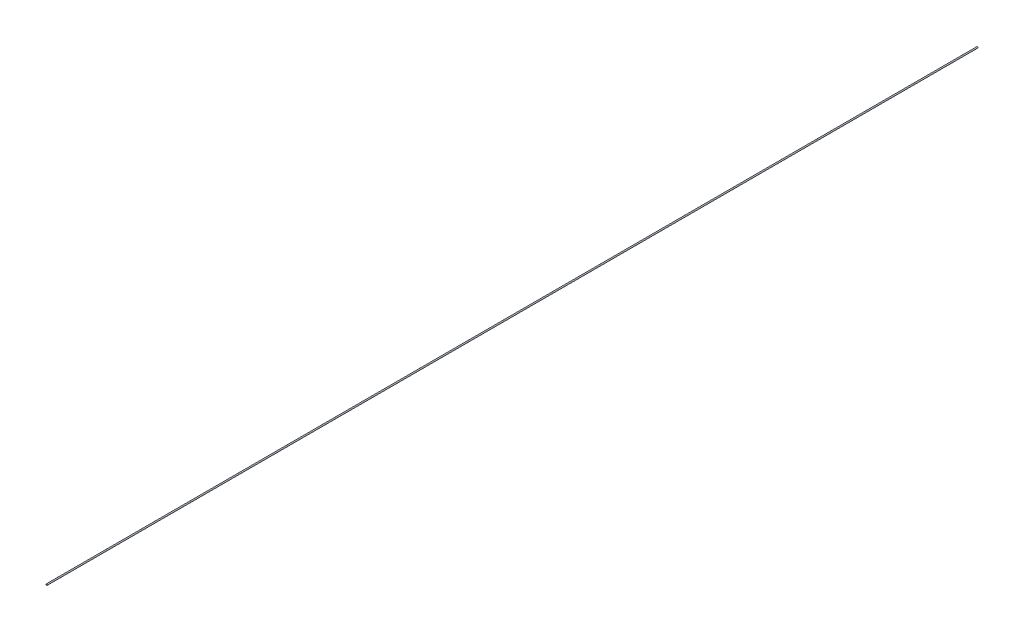
ISO-10303-21;
HEADER;
FILE_DESCRIPTION(('STEP AP214'),'2;1');
FILE_NAME('part.step','',(''),(''),'','','');
FILE_SCHEMA(('AUTOMOTIVE_DESIGN { 1 0 10303 214 1 1 1 1 }'));
ENDSEC;
DATA;
#1=APPLICATION_CONTEXT('core data for automotive mechanical design processes');
#2=APPLICATION_PROTOCOL_DEFINITION('international standard','automotive_design',2000,#1);
#3=PRODUCT_CONTEXT('',#1,'mechanical');
#4=PRODUCT('Part','Part','',(#3));
#5=PRODUCT_RELATED_PRODUCT_CATEGORY('part','',(#4));
#6=PRODUCT_DEFINITION_FORMATION('','',#4);
#7=PRODUCT_DEFINITION_CONTEXT('part definition',#1,'design');
#8=PRODUCT_DEFINITION('design','',#6,#7);
#9=PRODUCT_DEFINITION_SHAPE('','',#8);
#10=(LENGTH_UNIT() NAMED_UNIT(*) SI_UNIT(.MILLI.,.METRE.));
#11=(NAMED_UNIT(*) PLANE_ANGLE_UNIT() SI_UNIT($,.RADIAN.));
#12=(NAMED_UNIT(*) SI_UNIT($,.STERADIAN.) SOLID_ANGLE_UNIT());
#13=UNCERTAINTY_MEASURE_WITH_UNIT(LENGTH_MEASURE(1.E-05),#10,'distance_accuracy_value','');
#14=(GEOMETRIC_REPRESENTATION_CONTEXT(3) GLOBAL_UNCERTAINTY_ASSIGNED_CONTEXT((#13)) GLOBAL_UNIT_ASSIGNED_CONTEXT((#10,
#11,#12)) REPRESENTATION_CONTEXT('',''));
#15=CARTESIAN_POINT('',(0.,0.,0.));
#16=DIRECTION('',(0.,0.,1.));
#17=DIRECTION('',(1.,0.,0.));
#18=AXIS2_PLACEMENT_3D('',#15,#16,#17);
#19=CARTESIAN_POINT('',(0.,0.,-9000.));
#20=DIRECTION('',(0.,0.,1.));
#21=DIRECTION('',(1.,0.,0.));
#22=AXIS2_PLACEMENT_3D('',#19,#20,#21);
#23=CYLINDRICAL_SURFACE('',#22,6.);
#24=CARTESIAN_POINT('',(0.,0.,-9000.));
#25=DIRECTION('',(0.,0.,1.));
#26=DIRECTION('',(1.,0.,0.));
#27=AXIS2_PLACEMENT_3D('',#24,#25,#26);
#28=CIRCLE('',#27,6.);
#29=CARTESIAN_POINT('',(6.,0.,-9000.));
#30=VERTEX_POINT('',#29);
#31=EDGE_CURVE('E10',#30,#30,#28,.T.);
#32=ORIENTED_EDGE('',*,*,#31,.T.);
#33=EDGE_LOOP('',(#32));
#34=FACE_BOUND('',#33,.T.);
#35=CARTESIAN_POINT('',(0.,0.,0.));
#36=DIRECTION('',(0.,0.,1.));
#37=DIRECTION('',(1.,0.,0.));
#38=AXIS2_PLACEMENT_3D('',#35,#36,#37);
#39=CIRCLE('',#38,6.);
#40=CARTESIAN_POINT('',(6.,0.,0.));
#41=VERTEX_POINT('',#40);
#42=EDGE_CURVE('E35',#41,#41,#39,.T.);
#43=ORIENTED_EDGE('',*,*,#42,.F.);
#44=EDGE_LOOP('',(#43));
#45=FACE_BOUND('',#44,.T.);
#46=ADVANCED_FACE('F32',(#34,#45),#23,.T.);
#47=CARTESIAN_POINT('',(0.,0.,-9000.));
#48=DIRECTION('',(0.,0.,1.));
#49=DIRECTION('',(1.,0.,0.));
#50=AXIS2_PLACEMENT_3D('',#47,#48,#49);
#51=PLANE('',#50);
#52=ORIENTED_EDGE('',*,*,#31,.F.);
#53=EDGE_LOOP('',(#52));
#54=FACE_BOUND('',#53,.T.);
#55=ADVANCED_FACE('F51',(#54),#51,.F.);
#56=CARTESIAN_POINT('',(0.,0.,0.));
#57=DIRECTION('',(0.,0.,1.));
#58=DIRECTION('',(1.,0.,0.));
#59=AXIS2_PLACEMENT_3D('',#56,#57,#58);
#60=PLANE('',#59);
#61=ORIENTED_EDGE('',*,*,#42,.T.);
#62=EDGE_LOOP('',(#61));
#63=FACE_BOUND('',#62,.T.);
#64=ADVANCED_FACE('F48',(#63),#60,.T.);
#65=CLOSED_SHELL('',(#46,#55,#64));
#66=MANIFOLD_SOLID_BREP('B2',#65);
#67=ADVANCED_BREP_SHAPE_REPRESENTATION('',(#18,#66),#14);
#68=SHAPE_DEFINITION_REPRESENTATION(#9,#67);
ENDSEC;
END-ISO-10303-21;
